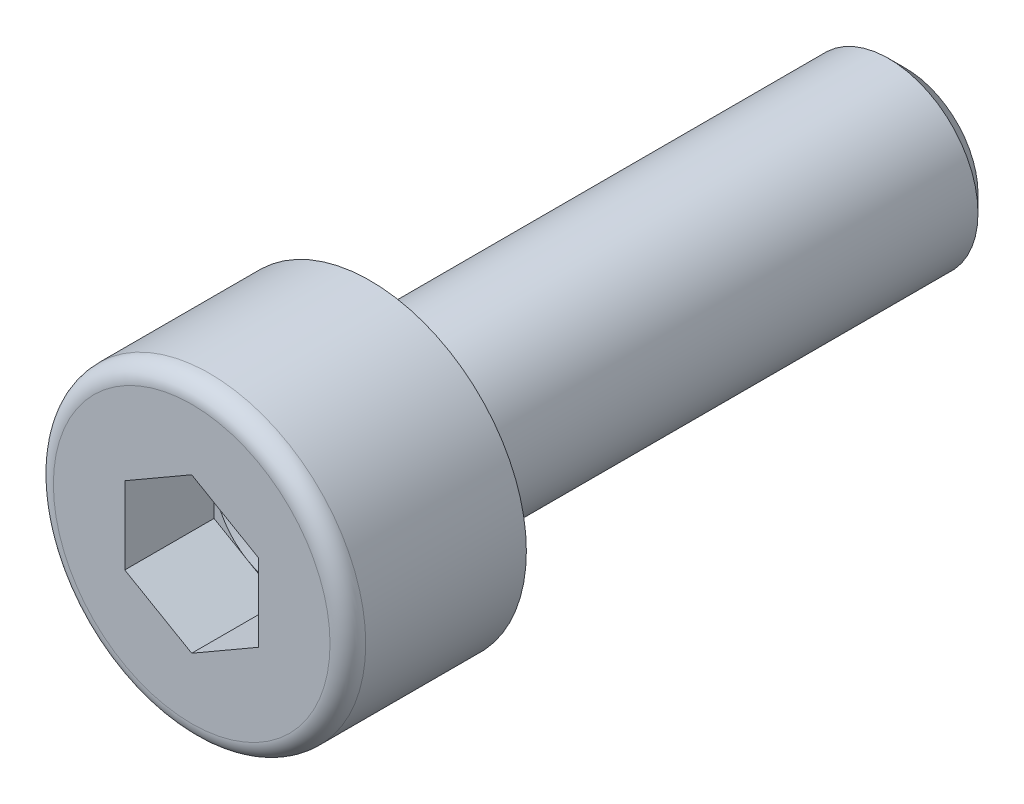
ISO-10303-21;
HEADER;
FILE_DESCRIPTION(('STEP AP214'),'2;1');
FILE_NAME('part.step','',(''),(''),'','','');
FILE_SCHEMA(('AUTOMOTIVE_DESIGN { 1 0 10303 214 1 1 1 1 }'));
ENDSEC;
DATA;
#1=APPLICATION_CONTEXT('core data for automotive mechanical design processes');
#2=APPLICATION_PROTOCOL_DEFINITION('international standard','automotive_design',2000,#1);
#3=PRODUCT_CONTEXT('',#1,'mechanical');
#4=PRODUCT('Part','Part','',(#3));
#5=PRODUCT_RELATED_PRODUCT_CATEGORY('part','',(#4));
#6=PRODUCT_DEFINITION_FORMATION('','',#4);
#7=PRODUCT_DEFINITION_CONTEXT('part definition',#1,'design');
#8=PRODUCT_DEFINITION('design','',#6,#7);
#9=PRODUCT_DEFINITION_SHAPE('','',#8);
#10=(LENGTH_UNIT() NAMED_UNIT(*) SI_UNIT(.MILLI.,.METRE.));
#11=(NAMED_UNIT(*) PLANE_ANGLE_UNIT() SI_UNIT($,.RADIAN.));
#12=(NAMED_UNIT(*) SI_UNIT($,.STERADIAN.) SOLID_ANGLE_UNIT());
#13=UNCERTAINTY_MEASURE_WITH_UNIT(LENGTH_MEASURE(1.E-05),#10,'distance_accuracy_value','');
#14=(GEOMETRIC_REPRESENTATION_CONTEXT(3) GLOBAL_UNCERTAINTY_ASSIGNED_CONTEXT((#13)) GLOBAL_UNIT_ASSIGNED_CONTEXT((#10,
#11,#12)) REPRESENTATION_CONTEXT('',''));
#15=CARTESIAN_POINT('',(0.,0.,0.));
#16=DIRECTION('',(0.,0.,1.));
#17=DIRECTION('',(1.,0.,0.));
#18=AXIS2_PLACEMENT_3D('',#15,#16,#17);
#19=CARTESIAN_POINT('',(0.,0.,-15.6211138875));
#20=DIRECTION('',(0.,0.,1.));
#21=DIRECTION('',(1.,0.,0.));
#22=AXIS2_PLACEMENT_3D('',#19,#20,#21);
#23=CONICAL_SURFACE('',#22,2.,0.785398163397448);
#24=CARTESIAN_POINT('',(0.,0.,-15.6211138875));
#25=DIRECTION('',(0.,0.,1.));
#26=DIRECTION('',(1.,0.,0.));
#27=AXIS2_PLACEMENT_3D('',#24,#25,#26);
#28=CIRCLE('',#27,2.);
#29=CARTESIAN_POINT('',(2.,0.,-15.6211138875));
#30=VERTEX_POINT('',#29);
#31=EDGE_CURVE('E240',#30,#30,#28,.T.);
#32=ORIENTED_EDGE('',*,*,#31,.F.);
#33=EDGE_LOOP('',(#32));
#34=FACE_BOUND('',#33,.T.);
#35=CARTESIAN_POINT('',(0.,0.,-16.));
#36=DIRECTION('',(0.,0.,-1.));
#37=DIRECTION('',(1.,0.,0.));
#38=AXIS2_PLACEMENT_3D('',#35,#36,#37);
#39=CIRCLE('',#38,1.6211138875);
#40=CARTESIAN_POINT('',(1.6211138875,0.,-16.));
#41=VERTEX_POINT('',#40);
#42=EDGE_CURVE('E161',#41,#41,#39,.T.);
#43=ORIENTED_EDGE('',*,*,#42,.F.);
#44=EDGE_LOOP('',(#43));
#45=FACE_BOUND('',#44,.T.);
#46=ADVANCED_FACE('F17',(#34,#45),#23,.T.);
#47=CARTESIAN_POINT('',(0.,0.,-4.2));
#48=DIRECTION('',(0.,0.,1.));
#49=DIRECTION('',(1.,0.,0.));
#50=AXIS2_PLACEMENT_3D('',#47,#48,#49);
#51=TOROIDAL_SURFACE('',#50,2.46487406649083,0.2);
#52=CARTESIAN_POINT('',(0.,0.,-4.));
#53=DIRECTION('',(0.,0.,1.));
#54=DIRECTION('',(1.,0.,0.));
#55=AXIS2_PLACEMENT_3D('',#52,#53,#54);
#56=CIRCLE('',#55,2.46487406649083);
#57=CARTESIAN_POINT('',(2.46487406649083,0.,-4.));
#58=VERTEX_POINT('',#57);
#59=EDGE_CURVE('E196',#58,#58,#56,.T.);
#60=ORIENTED_EDGE('',*,*,#59,.F.);
#61=EDGE_LOOP('',(#60));
#62=FACE_BOUND('',#61,.T.);
#63=CARTESIAN_POINT('',(0.,0.,-4.09922579489519));
#64=DIRECTION('',(0.,0.,-1.));
#65=DIRECTION('',(1.,0.,0.));
#66=AXIS2_PLACEMENT_3D('',#63,#64,#65);
#67=CIRCLE('',#66,2.29211828631114);
#68=CARTESIAN_POINT('',(2.29211828631114,0.,-4.09922579489519));
#69=VERTEX_POINT('',#68);
#70=EDGE_CURVE('E11',#69,#69,#67,.T.);
#71=ORIENTED_EDGE('',*,*,#70,.F.);
#72=EDGE_LOOP('',(#71));
#73=FACE_BOUND('',#72,.T.);
#74=ADVANCED_FACE('F452',(#62,#73),#51,.F.);
#75=CARTESIAN_POINT('',(0.,0.,-4.65406982827));
#76=DIRECTION('',(0.,0.,-1.));
#77=DIRECTION('',(-1.,0.,0.));
#78=AXIS2_PLACEMENT_3D('',#75,#76,#77);
#79=TOROIDAL_SURFACE('',#78,2.2,0.2);
#80=CARTESIAN_POINT('',(0.,0.,-4.65406982827));
#81=DIRECTION('',(0.,0.,-1.));
#82=DIRECTION('',(-1.,0.,0.));
#83=AXIS2_PLACEMENT_3D('',#80,#81,#82);
#84=CIRCLE('',#83,2.);
#85=CARTESIAN_POINT('',(-2.,0.,-4.65406982827));
#86=VERTEX_POINT('',#85);
#87=EDGE_CURVE('E243',#86,#86,#84,.T.);
#88=ORIENTED_EDGE('',*,*,#87,.F.);
#89=EDGE_LOOP('',(#88));
#90=FACE_BOUND('',#89,.T.);
#91=CARTESIAN_POINT('',(0.,0.,-4.55329562316518));
#92=DIRECTION('',(0.,0.,1.));
#93=DIRECTION('',(1.,0.,0.));
#94=AXIS2_PLACEMENT_3D('',#91,#92,#93);
#95=CIRCLE('',#94,2.02724421982031);
#96=CARTESIAN_POINT('',(2.02724421982031,0.,-4.55329562316518));
#97=VERTEX_POINT('',#96);
#98=EDGE_CURVE('E25',#97,#97,#95,.T.);
#99=ORIENTED_EDGE('',*,*,#98,.F.);
#100=EDGE_LOOP('',(#99));
#101=FACE_BOUND('',#100,.T.);
#102=ADVANCED_FACE('F458',(#90,#101),#79,.F.);
#103=CARTESIAN_POINT('',(0.,0.,-4.));
#104=DIRECTION('',(0.,0.,1.));
#105=DIRECTION('',(1.,0.,0.));
#106=AXIS2_PLACEMENT_3D('',#103,#104,#105);
#107=CONICAL_SURFACE('',#106,2.35,0.528074448426359);
#108=ORIENTED_EDGE('',*,*,#70,.T.);
#109=EDGE_LOOP('',(#108));
#110=FACE_BOUND('',#109,.T.);
#111=ORIENTED_EDGE('',*,*,#98,.T.);
#112=EDGE_LOOP('',(#111));
#113=FACE_BOUND('',#112,.T.);
#114=ADVANCED_FACE('F494',(#110,#113),#107,.T.);
#115=CARTESIAN_POINT('',(0.,0.,-2.));
#116=DIRECTION('',(0.,0.,1.));
#117=DIRECTION('',(1.,0.,0.));
#118=AXIS2_PLACEMENT_3D('',#115,#116,#117);
#119=CONICAL_SURFACE('',#118,1.5,1.22173047639603);
#120=CARTESIAN_POINT('',(0.,0.,-2.));
#121=DIRECTION('',(0.,0.,-1.));
#122=DIRECTION('',(-1.,0.,0.));
#123=AXIS2_PLACEMENT_3D('',#120,#121,#122);
#124=CIRCLE('',#123,1.5);
#125=CARTESIAN_POINT('',(-1.5,0.,-2.));
#126=VERTEX_POINT('',#125);
#127=CARTESIAN_POINT('',(-0.75,1.29903810567666,-2.));
#128=VERTEX_POINT('',#127);
#129=EDGE_CURVE('E395',#126,#128,#124,.T.);
#130=ORIENTED_EDGE('',*,*,#129,.F.);
#131=CARTESIAN_POINT('',(0.,0.,-2.));
#132=DIRECTION('',(0.,0.,-1.));
#133=DIRECTION('',(-1.,0.,0.));
#134=AXIS2_PLACEMENT_3D('',#131,#132,#133);
#135=CIRCLE('',#134,1.5);
#136=CARTESIAN_POINT('',(-0.75,-1.29903810567666,-2.));
#137=VERTEX_POINT('',#136);
#138=EDGE_CURVE('E222',#137,#126,#135,.T.);
#139=ORIENTED_EDGE('',*,*,#138,.F.);
#140=CARTESIAN_POINT('',(0.,0.,-2.));
#141=DIRECTION('',(0.,0.,-1.));
#142=DIRECTION('',(-1.,0.,0.));
#143=AXIS2_PLACEMENT_3D('',#140,#141,#142);
#144=CIRCLE('',#143,1.5);
#145=CARTESIAN_POINT('',(0.75,-1.29903810567666,-2.));
#146=VERTEX_POINT('',#145);
#147=EDGE_CURVE('E188',#146,#137,#144,.T.);
#148=ORIENTED_EDGE('',*,*,#147,.F.);
#149=CARTESIAN_POINT('',(0.,0.,-2.));
#150=DIRECTION('',(0.,0.,-1.));
#151=DIRECTION('',(-1.,0.,0.));
#152=AXIS2_PLACEMENT_3D('',#149,#150,#151);
#153=CIRCLE('',#152,1.5);
#154=CARTESIAN_POINT('',(1.5,0.,-2.));
#155=VERTEX_POINT('',#154);
#156=EDGE_CURVE('E189',#155,#146,#153,.T.);
#157=ORIENTED_EDGE('',*,*,#156,.F.);
#158=CARTESIAN_POINT('',(0.,0.,-2.));
#159=DIRECTION('',(0.,0.,-1.));
#160=DIRECTION('',(-1.,0.,0.));
#161=AXIS2_PLACEMENT_3D('',#158,#159,#160);
#162=CIRCLE('',#161,1.5);
#163=CARTESIAN_POINT('',(0.75,1.29903810567666,-2.));
#164=VERTEX_POINT('',#163);
#165=EDGE_CURVE('E168',#164,#155,#162,.T.);
#166=ORIENTED_EDGE('',*,*,#165,.F.);
#167=CARTESIAN_POINT('',(0.,0.,-2.));
#168=DIRECTION('',(0.,0.,-1.));
#169=DIRECTION('',(-1.,0.,0.));
#170=AXIS2_PLACEMENT_3D('',#167,#168,#169);
#171=CIRCLE('',#170,1.5);
#172=EDGE_CURVE('E184',#128,#164,#171,.T.);
#173=ORIENTED_EDGE('',*,*,#172,.F.);
#174=EDGE_LOOP('',(#130,#139,#148,#157,#166,#173));
#175=FACE_BOUND('',#174,.T.);
#176=CARTESIAN_POINT('',(0.,0.,-2.5459553513993));
#177=VERTEX_POINT('',#176);
#178=VERTEX_LOOP('',#177);
#179=FACE_BOUND('',#178,.T.);
#180=ADVANCED_FACE('F434',(#175,#179),#119,.F.);
#181=CARTESIAN_POINT('',(0.,0.,-2.));
#182=DIRECTION('',(0.,0.,1.));
#183=DIRECTION('',(1.,0.,0.));
#184=AXIS2_PLACEMENT_3D('',#181,#182,#183);
#185=PLANE('',#184);
#186=DIRECTION('',(-0.866025403784439,0.5,0.));
#187=VECTOR('',#186,1.);
#188=CARTESIAN_POINT('',(-0.75,-1.29903810567666,-2.));
#189=LINE('',#188,#187);
#190=CARTESIAN_POINT('',(-1.5,-0.866025403784439,-2.));
#191=VERTEX_POINT('',#190);
#192=EDGE_CURVE('E225',#137,#191,#189,.T.);
#193=ORIENTED_EDGE('',*,*,#192,.F.);
#194=ORIENTED_EDGE('',*,*,#138,.T.);
#195=DIRECTION('',(0.,1.,0.));
#196=VECTOR('',#195,1.);
#197=CARTESIAN_POINT('',(-1.5,0.,-2.));
#198=LINE('',#197,#196);
#199=EDGE_CURVE('E234',#191,#126,#198,.T.);
#200=ORIENTED_EDGE('',*,*,#199,.F.);
#201=EDGE_LOOP('',(#193,#194,#200));
#202=FACE_BOUND('',#201,.T.);
#203=ADVANCED_FACE('F432',(#202),#185,.T.);
#204=CARTESIAN_POINT('',(0.721250214161918,-1.31563680226942,-2.));
#205=DIRECTION('',(-0.5,0.866025403784439,0.));
#206=DIRECTION('',(0.,0.,1.));
#207=AXIS2_PLACEMENT_3D('',#204,#205,#206);
#208=PLANE('',#207);
#209=DIRECTION('',(-0.866025403784439,-0.5,0.));
#210=VECTOR('',#209,1.);
#211=CARTESIAN_POINT('',(0.721250214161918,-1.31563680226942,0.));
#212=LINE('',#211,#210);
#213=CARTESIAN_POINT('',(1.5,-0.866025403784439,0.));
#214=VERTEX_POINT('',#213);
#215=CARTESIAN_POINT('',(0.,-1.73205080756888,0.));
#216=VERTEX_POINT('',#215);
#217=EDGE_CURVE('E208',#214,#216,#212,.T.);
#218=ORIENTED_EDGE('',*,*,#217,.F.);
#219=DIRECTION('',(0.,0.,1.));
#220=VECTOR('',#219,1.);
#221=CARTESIAN_POINT('',(1.5,-0.866025403784439,-2.));
#222=LINE('',#221,#220);
#223=CARTESIAN_POINT('',(1.5,-0.866025403784439,-2.));
#224=VERTEX_POINT('',#223);
#225=EDGE_CURVE('E160',#224,#214,#222,.T.);
#226=ORIENTED_EDGE('',*,*,#225,.F.);
#227=DIRECTION('',(-0.866025403784439,-0.5,0.));
#228=VECTOR('',#227,1.);
#229=CARTESIAN_POINT('',(0.721250214161918,-1.31563680226942,-2.));
#230=LINE('',#229,#228);
#231=EDGE_CURVE('E193',#224,#146,#230,.T.);
#232=ORIENTED_EDGE('',*,*,#231,.T.);
#233=DIRECTION('',(-0.866025403784439,-0.5,0.));
#234=VECTOR('',#233,1.);
#235=CARTESIAN_POINT('',(0.721250214161918,-1.31563680226942,-2.));
#236=LINE('',#235,#234);
#237=CARTESIAN_POINT('',(0.,-1.73205080756888,-2.));
#238=VERTEX_POINT('',#237);
#239=EDGE_CURVE('E202',#146,#238,#236,.T.);
#240=ORIENTED_EDGE('',*,*,#239,.T.);
#241=DIRECTION('',(0.,0.,1.));
#242=VECTOR('',#241,1.);
#243=CARTESIAN_POINT('',(0.,-1.73205080756888,-2.));
#244=LINE('',#243,#242);
#245=EDGE_CURVE('E238',#238,#216,#244,.T.);
#246=ORIENTED_EDGE('',*,*,#245,.T.);
#247=EDGE_LOOP('',(#218,#226,#232,#240,#246));
#248=FACE_BOUND('',#247,.T.);
#249=ADVANCED_FACE('F484',(#248),#208,.T.);
#250=CARTESIAN_POINT('',(-0.75,-1.29903810567666,-2.));
#251=DIRECTION('',(0.5,0.866025403784439,0.));
#252=DIRECTION('',(0.,0.,-1.));
#253=AXIS2_PLACEMENT_3D('',#250,#251,#252);
#254=PLANE('',#253);
#255=DIRECTION('',(-0.866025403784439,0.5,0.));
#256=VECTOR('',#255,1.);
#257=CARTESIAN_POINT('',(-0.75,-1.29903810567666,0.));
#258=LINE('',#257,#256);
#259=CARTESIAN_POINT('',(-1.5,-0.866025403784439,0.));
#260=VERTEX_POINT('',#259);
#261=EDGE_CURVE('E213',#216,#260,#258,.T.);
#262=ORIENTED_EDGE('',*,*,#261,.F.);
#263=ORIENTED_EDGE('',*,*,#245,.F.);
#264=DIRECTION('',(-0.866025403784439,0.5,0.));
#265=VECTOR('',#264,1.);
#266=CARTESIAN_POINT('',(-0.75,-1.29903810567666,-2.));
#267=LINE('',#266,#265);
#268=EDGE_CURVE('E344',#238,#137,#267,.T.);
#269=ORIENTED_EDGE('',*,*,#268,.T.);
#270=ORIENTED_EDGE('',*,*,#192,.T.);
#271=DIRECTION('',(0.,0.,1.));
#272=VECTOR('',#271,1.);
#273=CARTESIAN_POINT('',(-1.5,-0.866025403784439,-2.));
#274=LINE('',#273,#272);
#275=EDGE_CURVE('E239',#191,#260,#274,.T.);
#276=ORIENTED_EDGE('',*,*,#275,.T.);
#277=EDGE_LOOP('',(#262,#263,#269,#270,#276));
#278=FACE_BOUND('',#277,.T.);
#279=ADVANCED_FACE('F428',(#278),#254,.T.);
#280=CARTESIAN_POINT('',(-1.5,0.,-2.));
#281=DIRECTION('',(1.,0.,0.));
#282=DIRECTION('',(0.,-1.,0.));
#283=AXIS2_PLACEMENT_3D('',#280,#281,#282);
#284=PLANE('',#283);
#285=DIRECTION('',(0.,1.,0.));
#286=VECTOR('',#285,1.);
#287=CARTESIAN_POINT('',(-1.5,0.,0.));
#288=LINE('',#287,#286);
#289=CARTESIAN_POINT('',(-1.5,0.866025403784439,0.));
#290=VERTEX_POINT('',#289);
#291=EDGE_CURVE('E217',#260,#290,#288,.T.);
#292=ORIENTED_EDGE('',*,*,#291,.F.);
#293=ORIENTED_EDGE('',*,*,#275,.F.);
#294=ORIENTED_EDGE('',*,*,#199,.T.);
#295=DIRECTION('',(0.,1.,0.));
#296=VECTOR('',#295,1.);
#297=CARTESIAN_POINT('',(-1.5,0.,-2.));
#298=LINE('',#297,#296);
#299=CARTESIAN_POINT('',(-1.5,0.866025403784439,-2.));
#300=VERTEX_POINT('',#299);
#301=EDGE_CURVE('E402',#126,#300,#298,.T.);
#302=ORIENTED_EDGE('',*,*,#301,.T.);
#303=DIRECTION('',(0.,0.,1.));
#304=VECTOR('',#303,1.);
#305=CARTESIAN_POINT('',(-1.5,0.866025403784439,-2.));
#306=LINE('',#305,#304);
#307=EDGE_CURVE('E255',#300,#290,#306,.T.);
#308=ORIENTED_EDGE('',*,*,#307,.T.);
#309=EDGE_LOOP('',(#292,#293,#294,#302,#308));
#310=FACE_BOUND('',#309,.T.);
#311=ADVANCED_FACE('F412',(#310),#284,.T.);
#312=CARTESIAN_POINT('',(-0.742562637900043,1.30333206868713,-2.));
#313=DIRECTION('',(0.5,-0.866025403784439,0.));
#314=DIRECTION('',(0.,0.,-1.));
#315=AXIS2_PLACEMENT_3D('',#312,#313,#314);
#316=PLANE('',#315);
#317=DIRECTION('',(0.866025403784439,0.5,0.));
#318=VECTOR('',#317,1.);
#319=CARTESIAN_POINT('',(-0.742562637900043,1.30333206868713,0.));
#320=LINE('',#319,#318);
#321=CARTESIAN_POINT('',(0.,1.73205080756888,0.));
#322=VERTEX_POINT('',#321);
#323=EDGE_CURVE('E221',#290,#322,#320,.T.);
#324=ORIENTED_EDGE('',*,*,#323,.F.);
#325=ORIENTED_EDGE('',*,*,#307,.F.);
#326=DIRECTION('',(0.866025403784439,0.5,0.));
#327=VECTOR('',#326,1.);
#328=CARTESIAN_POINT('',(-0.742562637900043,1.30333206868713,-2.));
#329=LINE('',#328,#327);
#330=EDGE_CURVE('E388',#300,#128,#329,.T.);
#331=ORIENTED_EDGE('',*,*,#330,.T.);
#332=DIRECTION('',(0.866025403784439,0.5,0.));
#333=VECTOR('',#332,1.);
#334=CARTESIAN_POINT('',(-0.742562637900043,1.30333206868713,-2.));
#335=LINE('',#334,#333);
#336=CARTESIAN_POINT('',(0.,1.73205080756888,-2.));
#337=VERTEX_POINT('',#336);
#338=EDGE_CURVE('E382',#128,#337,#335,.T.);
#339=ORIENTED_EDGE('',*,*,#338,.T.);
#340=DIRECTION('',(0.,0.,1.));
#341=VECTOR('',#340,1.);
#342=CARTESIAN_POINT('',(0.,1.73205080756888,-2.));
#343=LINE('',#342,#341);
#344=EDGE_CURVE('E252',#337,#322,#343,.T.);
#345=ORIENTED_EDGE('',*,*,#344,.T.);
#346=EDGE_LOOP('',(#324,#325,#331,#339,#345));
#347=FACE_BOUND('',#346,.T.);
#348=ADVANCED_FACE('F421',(#347),#316,.T.);
#349=CARTESIAN_POINT('',(0.75,1.29903810567666,-2.));
#350=DIRECTION('',(-0.5,-0.866025403784439,0.));
#351=DIRECTION('',(-0.866025403784439,0.5,0.));
#352=AXIS2_PLACEMENT_3D('',#349,#350,#351);
#353=PLANE('',#352);
#354=DIRECTION('',(0.866025403784439,-0.5,0.));
#355=VECTOR('',#354,1.);
#356=CARTESIAN_POINT('',(0.75,1.29903810567666,0.));
#357=LINE('',#356,#355);
#358=CARTESIAN_POINT('',(1.5,0.866025403784439,0.));
#359=VERTEX_POINT('',#358);
#360=EDGE_CURVE('E229',#322,#359,#357,.T.);
#361=ORIENTED_EDGE('',*,*,#360,.F.);
#362=ORIENTED_EDGE('',*,*,#344,.F.);
#363=DIRECTION('',(0.866025403784439,-0.5,0.));
#364=VECTOR('',#363,1.);
#365=CARTESIAN_POINT('',(0.75,1.29903810567666,-2.));
#366=LINE('',#365,#364);
#367=EDGE_CURVE('E174',#337,#164,#366,.T.);
#368=ORIENTED_EDGE('',*,*,#367,.T.);
#369=DIRECTION('',(0.866025403784439,-0.5,0.));
#370=VECTOR('',#369,1.);
#371=CARTESIAN_POINT('',(0.75,1.29903810567666,-2.));
#372=LINE('',#371,#370);
#373=CARTESIAN_POINT('',(1.5,0.866025403784439,-2.));
#374=VERTEX_POINT('',#373);
#375=EDGE_CURVE('E166',#164,#374,#372,.T.);
#376=ORIENTED_EDGE('',*,*,#375,.T.);
#377=DIRECTION('',(0.,0.,1.));
#378=VECTOR('',#377,1.);
#379=CARTESIAN_POINT('',(1.5,0.866025403784439,-2.));
#380=LINE('',#379,#378);
#381=EDGE_CURVE('E147',#374,#359,#380,.T.);
#382=ORIENTED_EDGE('',*,*,#381,.T.);
#383=EDGE_LOOP('',(#361,#362,#368,#376,#382));
#384=FACE_BOUND('',#383,.T.);
#385=ADVANCED_FACE('F172',(#384),#353,.T.);
#386=CARTESIAN_POINT('',(1.5,0.,-2.));
#387=DIRECTION('',(-1.,0.,0.));
#388=DIRECTION('',(0.,0.,1.));
#389=AXIS2_PLACEMENT_3D('',#386,#387,#388);
#390=PLANE('',#389);
#391=DIRECTION('',(0.,-1.,0.));
#392=VECTOR('',#391,1.);
#393=CARTESIAN_POINT('',(1.5,0.,0.));
#394=LINE('',#393,#392);
#395=EDGE_CURVE('E154',#359,#214,#394,.T.);
#396=ORIENTED_EDGE('',*,*,#395,.F.);
#397=ORIENTED_EDGE('',*,*,#381,.F.);
#398=DIRECTION('',(0.,-1.,0.));
#399=VECTOR('',#398,1.);
#400=CARTESIAN_POINT('',(1.5,0.,-2.));
#401=LINE('',#400,#399);
#402=EDGE_CURVE('E151',#374,#155,#401,.T.);
#403=ORIENTED_EDGE('',*,*,#402,.T.);
#404=DIRECTION('',(0.,-1.,0.));
#405=VECTOR('',#404,1.);
#406=CARTESIAN_POINT('',(1.5,0.,-2.));
#407=LINE('',#406,#405);
#408=EDGE_CURVE('E170',#155,#224,#407,.T.);
#409=ORIENTED_EDGE('',*,*,#408,.T.);
#410=ORIENTED_EDGE('',*,*,#225,.T.);
#411=EDGE_LOOP('',(#396,#397,#403,#409,#410));
#412=FACE_BOUND('',#411,.T.);
#413=ADVANCED_FACE('F149',(#412),#390,.T.);
#414=CARTESIAN_POINT('',(-0.508840520662192,0.,-16.));
#415=DIRECTION('',(0.,0.,1.));
#416=DIRECTION('',(1.,0.,0.));
#417=AXIS2_PLACEMENT_3D('',#414,#415,#416);
#418=PLANE('',#417);
#419=ORIENTED_EDGE('',*,*,#42,.T.);
#420=EDGE_LOOP('',(#419));
#421=FACE_BOUND('',#420,.T.);
#422=ADVANCED_FACE('F464',(#421),#418,.F.);
#423=CARTESIAN_POINT('',(0.,0.,-8.));
#424=DIRECTION('',(0.,0.,1.));
#425=DIRECTION('',(1.,0.,0.));
#426=AXIS2_PLACEMENT_3D('',#423,#424,#425);
#427=CYLINDRICAL_SURFACE('',#426,2.);
#428=ORIENTED_EDGE('',*,*,#87,.T.);
#429=EDGE_LOOP('',(#428));
#430=FACE_BOUND('',#429,.T.);
#431=ORIENTED_EDGE('',*,*,#31,.T.);
#432=EDGE_LOOP('',(#431));
#433=FACE_BOUND('',#432,.T.);
#434=ADVANCED_FACE('F466',(#430,#433),#427,.T.);
#435=CARTESIAN_POINT('',(-1.61056634651914,0.,-4.));
#436=DIRECTION('',(0.,0.,1.));
#437=DIRECTION('',(1.,0.,0.));
#438=AXIS2_PLACEMENT_3D('',#435,#436,#437);
#439=PLANE('',#438);
#440=CARTESIAN_POINT('',(0.,0.,-4.));
#441=DIRECTION('',(0.,0.,1.));
#442=DIRECTION('',(1.,0.,0.));
#443=AXIS2_PLACEMENT_3D('',#440,#441,#442);
#444=CIRCLE('',#443,3.5);
#445=CARTESIAN_POINT('',(3.5,0.,-4.));
#446=VERTEX_POINT('',#445);
#447=EDGE_CURVE('E194',#446,#446,#444,.T.);
#448=ORIENTED_EDGE('',*,*,#447,.F.);
#449=EDGE_LOOP('',(#448));
#450=FACE_BOUND('',#449,.T.);
#451=ORIENTED_EDGE('',*,*,#59,.T.);
#452=EDGE_LOOP('',(#451));
#453=FACE_BOUND('',#452,.T.);
#454=ADVANCED_FACE('F473',(#450,#453),#439,.F.);
#455=CARTESIAN_POINT('',(0.,0.,-8.));
#456=DIRECTION('',(0.,0.,1.));
#457=DIRECTION('',(1.,0.,0.));
#458=AXIS2_PLACEMENT_3D('',#455,#456,#457);
#459=CYLINDRICAL_SURFACE('',#458,3.5);
#460=ORIENTED_EDGE('',*,*,#447,.T.);
#461=EDGE_LOOP('',(#460));
#462=FACE_BOUND('',#461,.T.);
#463=CARTESIAN_POINT('',(0.,0.,-0.4));
#464=DIRECTION('',(0.,0.,1.));
#465=DIRECTION('',(1.,0.,0.));
#466=AXIS2_PLACEMENT_3D('',#463,#464,#465);
#467=CIRCLE('',#466,3.5);
#468=CARTESIAN_POINT('',(3.5,0.,-0.4));
#469=VERTEX_POINT('',#468);
#470=EDGE_CURVE('E197',#469,#469,#467,.T.);
#471=ORIENTED_EDGE('',*,*,#470,.F.);
#472=EDGE_LOOP('',(#471));
#473=FACE_BOUND('',#472,.T.);
#474=ADVANCED_FACE('F636',(#462,#473),#459,.T.);
#475=CARTESIAN_POINT('',(0.,0.,-0.4));
#476=DIRECTION('',(0.,0.,1.));
#477=DIRECTION('',(1.,0.,0.));
#478=AXIS2_PLACEMENT_3D('',#475,#476,#477);
#479=TOROIDAL_SURFACE('',#478,3.1,0.4);
#480=CARTESIAN_POINT('',(0.,0.,0.));
#481=DIRECTION('',(0.,0.,1.));
#482=DIRECTION('',(1.,0.,0.));
#483=AXIS2_PLACEMENT_3D('',#480,#481,#482);
#484=CIRCLE('',#483,3.1);
#485=CARTESIAN_POINT('',(3.1,0.,0.));
#486=VERTEX_POINT('',#485);
#487=EDGE_CURVE('E209',#486,#486,#484,.T.);
#488=ORIENTED_EDGE('',*,*,#487,.F.);
#489=EDGE_LOOP('',(#488));
#490=FACE_BOUND('',#489,.T.);
#491=ORIENTED_EDGE('',*,*,#470,.T.);
#492=EDGE_LOOP('',(#491));
#493=FACE_BOUND('',#492,.T.);
#494=ADVANCED_FACE('F631',(#490,#493),#479,.T.);
#495=CARTESIAN_POINT('',(-1.10172582585694,0.,0.));
#496=DIRECTION('',(0.,0.,-1.));
#497=DIRECTION('',(0.,-1.,0.));
#498=AXIS2_PLACEMENT_3D('',#495,#496,#497);
#499=PLANE('',#498);
#500=ORIENTED_EDGE('',*,*,#395,.T.);
#501=ORIENTED_EDGE('',*,*,#217,.T.);
#502=ORIENTED_EDGE('',*,*,#261,.T.);
#503=ORIENTED_EDGE('',*,*,#291,.T.);
#504=ORIENTED_EDGE('',*,*,#323,.T.);
#505=ORIENTED_EDGE('',*,*,#360,.T.);
#506=EDGE_LOOP('',(#500,#501,#502,#503,#504,#505));
#507=FACE_BOUND('',#506,.T.);
#508=ORIENTED_EDGE('',*,*,#487,.T.);
#509=EDGE_LOOP('',(#508));
#510=FACE_BOUND('',#509,.T.);
#511=ADVANCED_FACE('F424',(#507,#510),#499,.F.);
#512=CARTESIAN_POINT('',(0.,0.,-2.));
#513=DIRECTION('',(0.,0.,1.));
#514=DIRECTION('',(1.,0.,0.));
#515=AXIS2_PLACEMENT_3D('',#512,#513,#514);
#516=PLANE('',#515);
#517=ORIENTED_EDGE('',*,*,#239,.F.);
#518=ORIENTED_EDGE('',*,*,#147,.T.);
#519=ORIENTED_EDGE('',*,*,#268,.F.);
#520=EDGE_LOOP('',(#517,#518,#519));
#521=FACE_BOUND('',#520,.T.);
#522=ADVANCED_FACE('F613',(#521),#516,.T.);
#523=CARTESIAN_POINT('',(0.,0.,-2.));
#524=DIRECTION('',(0.,0.,1.));
#525=DIRECTION('',(1.,0.,0.));
#526=AXIS2_PLACEMENT_3D('',#523,#524,#525);
#527=PLANE('',#526);
#528=ORIENTED_EDGE('',*,*,#408,.F.);
#529=ORIENTED_EDGE('',*,*,#156,.T.);
#530=ORIENTED_EDGE('',*,*,#231,.F.);
#531=EDGE_LOOP('',(#528,#529,#530));
#532=FACE_BOUND('',#531,.T.);
#533=ADVANCED_FACE('F448',(#532),#527,.T.);
#534=CARTESIAN_POINT('',(0.,0.,-2.));
#535=DIRECTION('',(0.,0.,1.));
#536=DIRECTION('',(1.,0.,0.));
#537=AXIS2_PLACEMENT_3D('',#534,#535,#536);
#538=PLANE('',#537);
#539=ORIENTED_EDGE('',*,*,#375,.F.);
#540=ORIENTED_EDGE('',*,*,#165,.T.);
#541=ORIENTED_EDGE('',*,*,#402,.F.);
#542=EDGE_LOOP('',(#539,#540,#541));
#543=FACE_BOUND('',#542,.T.);
#544=ADVANCED_FACE('F165',(#543),#538,.T.);
#545=CARTESIAN_POINT('',(0.,0.,-2.));
#546=DIRECTION('',(0.,0.,1.));
#547=DIRECTION('',(1.,0.,0.));
#548=AXIS2_PLACEMENT_3D('',#545,#546,#547);
#549=PLANE('',#548);
#550=ORIENTED_EDGE('',*,*,#338,.F.);
#551=ORIENTED_EDGE('',*,*,#172,.T.);
#552=ORIENTED_EDGE('',*,*,#367,.F.);
#553=EDGE_LOOP('',(#550,#551,#552));
#554=FACE_BOUND('',#553,.T.);
#555=ADVANCED_FACE('F438',(#554),#549,.T.);
#556=CARTESIAN_POINT('',(0.,0.,-2.));
#557=DIRECTION('',(0.,0.,1.));
#558=DIRECTION('',(1.,0.,0.));
#559=AXIS2_PLACEMENT_3D('',#556,#557,#558);
#560=PLANE('',#559);
#561=ORIENTED_EDGE('',*,*,#301,.F.);
#562=ORIENTED_EDGE('',*,*,#129,.T.);
#563=ORIENTED_EDGE('',*,*,#330,.F.);
#564=EDGE_LOOP('',(#561,#562,#563));
#565=FACE_BOUND('',#564,.T.);
#566=ADVANCED_FACE('F419',(#565),#560,.T.);
#567=CLOSED_SHELL('',(#46,#74,#102,#114,#180,#203,#249,#279,#311,#348,#385,#413,#422,#434,#454,
#474,#494,#511,#522,#533,#544,#555,#566));
#568=MANIFOLD_SOLID_BREP('B1',#567);
#569=ADVANCED_BREP_SHAPE_REPRESENTATION('',(#18,#568),#14);
#570=SHAPE_DEFINITION_REPRESENTATION(#9,#569);
ENDSEC;
END-ISO-10303-21;
